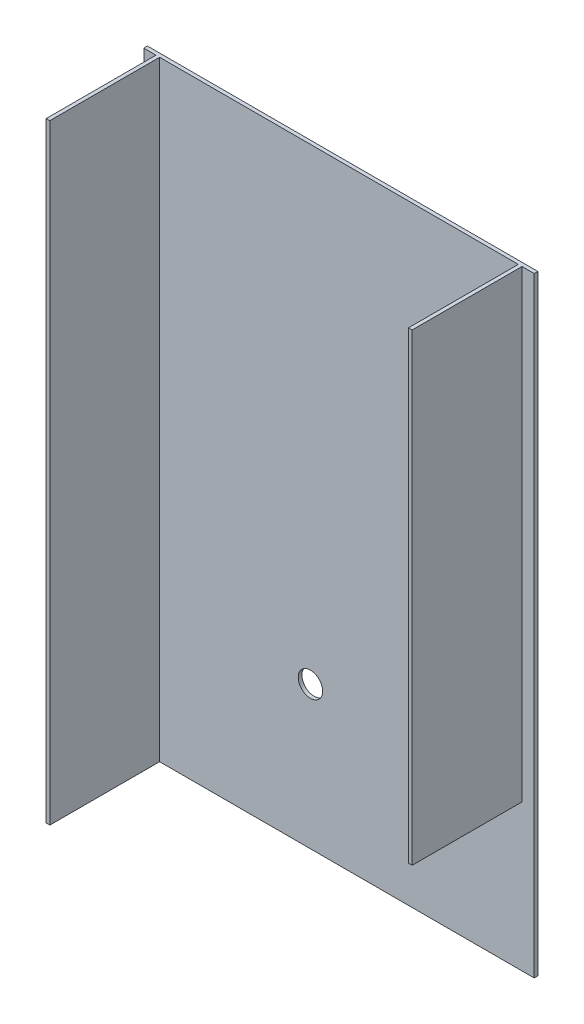
ISO-10303-21;
HEADER;
FILE_DESCRIPTION(('STEP AP214'),'2;1');
FILE_NAME('part.step','',(''),(''),'','','');
FILE_SCHEMA(('AUTOMOTIVE_DESIGN { 1 0 10303 214 1 1 1 1 }'));
ENDSEC;
DATA;
#1=APPLICATION_CONTEXT('core data for automotive mechanical design processes');
#2=APPLICATION_PROTOCOL_DEFINITION('international standard','automotive_design',2000,#1);
#3=PRODUCT_CONTEXT('',#1,'mechanical');
#4=PRODUCT('Part','Part','',(#3));
#5=PRODUCT_RELATED_PRODUCT_CATEGORY('part','',(#4));
#6=PRODUCT_DEFINITION_FORMATION('','',#4);
#7=PRODUCT_DEFINITION_CONTEXT('part definition',#1,'design');
#8=PRODUCT_DEFINITION('design','',#6,#7);
#9=PRODUCT_DEFINITION_SHAPE('','',#8);
#10=(LENGTH_UNIT() NAMED_UNIT(*) SI_UNIT(.MILLI.,.METRE.));
#11=(NAMED_UNIT(*) PLANE_ANGLE_UNIT() SI_UNIT($,.RADIAN.));
#12=(NAMED_UNIT(*) SI_UNIT($,.STERADIAN.) SOLID_ANGLE_UNIT());
#13=UNCERTAINTY_MEASURE_WITH_UNIT(LENGTH_MEASURE(1.E-05),#10,'distance_accuracy_value','');
#14=(GEOMETRIC_REPRESENTATION_CONTEXT(3) GLOBAL_UNCERTAINTY_ASSIGNED_CONTEXT((#13)) GLOBAL_UNIT_ASSIGNED_CONTEXT((#10,
#11,#12)) REPRESENTATION_CONTEXT('',''));
#15=CARTESIAN_POINT('',(0.,0.,0.));
#16=DIRECTION('',(0.,0.,1.));
#17=DIRECTION('',(1.,0.,0.));
#18=AXIS2_PLACEMENT_3D('',#15,#16,#17);
#19=CARTESIAN_POINT('',(0.,0.,1.5));
#20=DIRECTION('',(0.,0.,1.));
#21=DIRECTION('',(1.,0.,0.));
#22=AXIS2_PLACEMENT_3D('',#19,#20,#21);
#23=PLANE('',#22);
#24=CARTESIAN_POINT('',(-11.69,-66.6,1.5));
#25=DIRECTION('',(0.,0.,1.));
#26=DIRECTION('',(1.,0.,0.));
#27=AXIS2_PLACEMENT_3D('',#24,#25,#26);
#28=CIRCLE('',#27,5.);
#29=CARTESIAN_POINT('',(-6.69,-66.6,1.5));
#30=VERTEX_POINT('',#29);
#31=EDGE_CURVE('E190',#30,#30,#28,.T.);
#32=ORIENTED_EDGE('',*,*,#31,.F.);
#33=EDGE_LOOP('',(#32));
#34=FACE_BOUND('',#33,.T.);
#35=DIRECTION('',(1.,0.,0.));
#36=VECTOR('',#35,1.);
#37=CARTESIAN_POINT('',(73.5000000000001,-65.,1.5));
#38=LINE('',#37,#36);
#39=CARTESIAN_POINT('',(73.5000000000001,-65.,1.5));
#40=VERTEX_POINT('',#39);
#41=CARTESIAN_POINT('',(75.0000000000001,-65.,1.5));
#42=VERTEX_POINT('',#41);
#43=EDGE_CURVE('E54',#40,#42,#38,.T.);
#44=ORIENTED_EDGE('',*,*,#43,.F.);
#45=DIRECTION('',(0.,-1.,0.));
#46=VECTOR('',#45,1.);
#47=CARTESIAN_POINT('',(73.5,125.,1.5));
#48=LINE('',#47,#46);
#49=CARTESIAN_POINT('',(73.5,125.,1.5));
#50=VERTEX_POINT('',#49);
#51=EDGE_CURVE('E139',#50,#40,#48,.T.);
#52=ORIENTED_EDGE('',*,*,#51,.F.);
#53=DIRECTION('',(-1.,0.,0.));
#54=VECTOR('',#53,1.);
#55=CARTESIAN_POINT('',(-80.,125.,1.5));
#56=LINE('',#55,#54);
#57=CARTESIAN_POINT('',(-73.5,125.,1.5));
#58=VERTEX_POINT('',#57);
#59=EDGE_CURVE('E127',#50,#58,#56,.T.);
#60=ORIENTED_EDGE('',*,*,#59,.T.);
#61=DIRECTION('',(0.,-1.,0.));
#62=VECTOR('',#61,1.);
#63=CARTESIAN_POINT('',(-73.5,0.,1.5));
#64=LINE('',#63,#62);
#65=CARTESIAN_POINT('',(-73.5,-125.,1.5));
#66=VERTEX_POINT('',#65);
#67=EDGE_CURVE('E169',#58,#66,#64,.T.);
#68=ORIENTED_EDGE('',*,*,#67,.T.);
#69=DIRECTION('',(1.,0.,0.));
#70=VECTOR('',#69,1.);
#71=CARTESIAN_POINT('',(-80.,-125.,1.5));
#72=LINE('',#71,#70);
#73=CARTESIAN_POINT('',(80.,-125.,1.5));
#74=VERTEX_POINT('',#73);
#75=EDGE_CURVE('E202',#66,#74,#72,.T.);
#76=ORIENTED_EDGE('',*,*,#75,.T.);
#77=DIRECTION('',(0.,1.,0.));
#78=VECTOR('',#77,1.);
#79=CARTESIAN_POINT('',(80.,125.,1.5));
#80=LINE('',#79,#78);
#81=CARTESIAN_POINT('',(80.,125.,1.5));
#82=VERTEX_POINT('',#81);
#83=EDGE_CURVE('E196',#74,#82,#80,.T.);
#84=ORIENTED_EDGE('',*,*,#83,.T.);
#85=CARTESIAN_POINT('',(75.0000000000001,125.,1.5));
#86=VERTEX_POINT('',#85);
#87=EDGE_CURVE('E136',#82,#86,#56,.T.);
#88=ORIENTED_EDGE('',*,*,#87,.T.);
#89=DIRECTION('',(0.,-1.,0.));
#90=VECTOR('',#89,1.);
#91=CARTESIAN_POINT('',(75.,125.,1.5));
#92=LINE('',#91,#90);
#93=EDGE_CURVE('E59',#86,#42,#92,.T.);
#94=ORIENTED_EDGE('',*,*,#93,.T.);
#95=EDGE_LOOP('',(#44,#52,#60,#68,#76,#84,#88,#94));
#96=FACE_BOUND('',#95,.T.);
#97=ADVANCED_FACE('F39',(#34,#96),#23,.T.);
#98=CARTESIAN_POINT('',(80.,125.,1.5));
#99=DIRECTION('',(-1.,0.,0.));
#100=DIRECTION('',(0.,-1.,0.));
#101=AXIS2_PLACEMENT_3D('',#98,#99,#100);
#102=PLANE('',#101);
#103=DIRECTION('',(0.,1.,0.));
#104=VECTOR('',#103,1.);
#105=CARTESIAN_POINT('',(80.,125.,0.));
#106=LINE('',#105,#104);
#107=CARTESIAN_POINT('',(80.,-125.,0.));
#108=VERTEX_POINT('',#107);
#109=CARTESIAN_POINT('',(80.,125.,0.));
#110=VERTEX_POINT('',#109);
#111=EDGE_CURVE('E193',#108,#110,#106,.T.);
#112=ORIENTED_EDGE('',*,*,#111,.T.);
#113=DIRECTION('',(0.,0.,-1.));
#114=VECTOR('',#113,1.);
#115=CARTESIAN_POINT('',(80.,125.,1.5));
#116=LINE('',#115,#114);
#117=EDGE_CURVE('E11',#82,#110,#116,.T.);
#118=ORIENTED_EDGE('',*,*,#117,.F.);
#119=ORIENTED_EDGE('',*,*,#83,.F.);
#120=DIRECTION('',(0.,0.,-1.));
#121=VECTOR('',#120,1.);
#122=CARTESIAN_POINT('',(80.,-125.,1.5));
#123=LINE('',#122,#121);
#124=EDGE_CURVE('E205',#74,#108,#123,.T.);
#125=ORIENTED_EDGE('',*,*,#124,.T.);
#126=EDGE_LOOP('',(#112,#118,#119,#125));
#127=FACE_BOUND('',#126,.T.);
#128=ADVANCED_FACE('F41',(#127),#102,.F.);
#129=CARTESIAN_POINT('',(-80.,125.,1.5));
#130=DIRECTION('',(0.,-1.,0.));
#131=DIRECTION('',(0.,0.,-1.));
#132=AXIS2_PLACEMENT_3D('',#129,#130,#131);
#133=PLANE('',#132);
#134=DIRECTION('',(-1.,0.,0.));
#135=VECTOR('',#134,1.);
#136=CARTESIAN_POINT('',(-80.,125.,0.));
#137=LINE('',#136,#135);
#138=CARTESIAN_POINT('',(-80.,125.,0.));
#139=VERTEX_POINT('',#138);
#140=EDGE_CURVE('E208',#110,#139,#137,.T.);
#141=ORIENTED_EDGE('',*,*,#140,.T.);
#142=DIRECTION('',(0.,0.,-1.));
#143=VECTOR('',#142,1.);
#144=CARTESIAN_POINT('',(-80.,125.,1.5));
#145=LINE('',#144,#143);
#146=CARTESIAN_POINT('',(-80.,125.,1.5));
#147=VERTEX_POINT('',#146);
#148=EDGE_CURVE('E47',#147,#139,#145,.T.);
#149=ORIENTED_EDGE('',*,*,#148,.F.);
#150=CARTESIAN_POINT('',(-75.,125.,1.5));
#151=VERTEX_POINT('',#150);
#152=EDGE_CURVE('E137',#151,#147,#56,.T.);
#153=ORIENTED_EDGE('',*,*,#152,.F.);
#154=DIRECTION('',(0.,0.,-1.));
#155=VECTOR('',#154,1.);
#156=CARTESIAN_POINT('',(-75.,125.,46.5));
#157=LINE('',#156,#155);
#158=CARTESIAN_POINT('',(-75.,125.,46.5));
#159=VERTEX_POINT('',#158);
#160=EDGE_CURVE('E186',#159,#151,#157,.T.);
#161=ORIENTED_EDGE('',*,*,#160,.F.);
#162=DIRECTION('',(-1.,0.,0.));
#163=VECTOR('',#162,1.);
#164=CARTESIAN_POINT('',(0.,125.,46.5));
#165=LINE('',#164,#163);
#166=CARTESIAN_POINT('',(-73.5,125.,46.5));
#167=VERTEX_POINT('',#166);
#168=EDGE_CURVE('E165',#167,#159,#165,.T.);
#169=ORIENTED_EDGE('',*,*,#168,.F.);
#170=DIRECTION('',(0.,0.,-1.));
#171=VECTOR('',#170,1.);
#172=CARTESIAN_POINT('',(-73.5,125.,46.5));
#173=LINE('',#172,#171);
#174=EDGE_CURVE('E134',#167,#58,#173,.T.);
#175=ORIENTED_EDGE('',*,*,#174,.T.);
#176=ORIENTED_EDGE('',*,*,#59,.F.);
#177=DIRECTION('',(0.,0.,-1.));
#178=VECTOR('',#177,1.);
#179=CARTESIAN_POINT('',(73.5,125.,46.5));
#180=LINE('',#179,#178);
#181=CARTESIAN_POINT('',(73.5,125.,46.5));
#182=VERTEX_POINT('',#181);
#183=EDGE_CURVE('E131',#182,#50,#180,.T.);
#184=ORIENTED_EDGE('',*,*,#183,.F.);
#185=DIRECTION('',(1.,0.,0.));
#186=VECTOR('',#185,1.);
#187=CARTESIAN_POINT('',(73.5,125.,46.5));
#188=LINE('',#187,#186);
#189=CARTESIAN_POINT('',(75.,125.,46.5));
#190=VERTEX_POINT('',#189);
#191=EDGE_CURVE('E143',#182,#190,#188,.T.);
#192=ORIENTED_EDGE('',*,*,#191,.T.);
#193=DIRECTION('',(0.,0.,-1.));
#194=VECTOR('',#193,1.);
#195=CARTESIAN_POINT('',(75.,125.,46.5));
#196=LINE('',#195,#194);
#197=EDGE_CURVE('E159',#190,#86,#196,.T.);
#198=ORIENTED_EDGE('',*,*,#197,.T.);
#199=ORIENTED_EDGE('',*,*,#87,.F.);
#200=ORIENTED_EDGE('',*,*,#117,.T.);
#201=EDGE_LOOP('',(#141,#149,#153,#161,#169,#175,#176,#184,#192,#198,#199,#200));
#202=FACE_BOUND('',#201,.T.);
#203=ADVANCED_FACE('F128',(#202),#133,.F.);
#204=CARTESIAN_POINT('',(-80.,125.,1.5));
#205=DIRECTION('',(1.,0.,0.));
#206=DIRECTION('',(0.,1.,0.));
#207=AXIS2_PLACEMENT_3D('',#204,#205,#206);
#208=PLANE('',#207);
#209=DIRECTION('',(0.,-1.,0.));
#210=VECTOR('',#209,1.);
#211=CARTESIAN_POINT('',(-80.,125.,0.));
#212=LINE('',#211,#210);
#213=CARTESIAN_POINT('',(-80.,-125.,0.));
#214=VERTEX_POINT('',#213);
#215=EDGE_CURVE('E210',#139,#214,#212,.T.);
#216=ORIENTED_EDGE('',*,*,#215,.T.);
#217=DIRECTION('',(0.,0.,-1.));
#218=VECTOR('',#217,1.);
#219=CARTESIAN_POINT('',(-80.,-125.,1.5));
#220=LINE('',#219,#218);
#221=CARTESIAN_POINT('',(-80.,-125.,1.5));
#222=VERTEX_POINT('',#221);
#223=EDGE_CURVE('E215',#222,#214,#220,.T.);
#224=ORIENTED_EDGE('',*,*,#223,.F.);
#225=DIRECTION('',(0.,-1.,0.));
#226=VECTOR('',#225,1.);
#227=CARTESIAN_POINT('',(-80.,125.,1.5));
#228=LINE('',#227,#226);
#229=EDGE_CURVE('E200',#147,#222,#228,.T.);
#230=ORIENTED_EDGE('',*,*,#229,.F.);
#231=ORIENTED_EDGE('',*,*,#148,.T.);
#232=EDGE_LOOP('',(#216,#224,#230,#231));
#233=FACE_BOUND('',#232,.T.);
#234=ADVANCED_FACE('F222',(#233),#208,.F.);
#235=CARTESIAN_POINT('',(-80.,-125.,1.5));
#236=DIRECTION('',(0.,1.,0.));
#237=DIRECTION('',(0.,0.,1.));
#238=AXIS2_PLACEMENT_3D('',#235,#236,#237);
#239=PLANE('',#238);
#240=DIRECTION('',(1.,0.,0.));
#241=VECTOR('',#240,1.);
#242=CARTESIAN_POINT('',(-80.,-125.,0.));
#243=LINE('',#242,#241);
#244=EDGE_CURVE('E198',#214,#108,#243,.T.);
#245=ORIENTED_EDGE('',*,*,#244,.T.);
#246=ORIENTED_EDGE('',*,*,#124,.F.);
#247=ORIENTED_EDGE('',*,*,#75,.F.);
#248=DIRECTION('',(0.,0.,-1.));
#249=VECTOR('',#248,1.);
#250=CARTESIAN_POINT('',(-73.5,-125.,46.5));
#251=LINE('',#250,#249);
#252=CARTESIAN_POINT('',(-73.5,-125.,46.5));
#253=VERTEX_POINT('',#252);
#254=EDGE_CURVE('E180',#253,#66,#251,.T.);
#255=ORIENTED_EDGE('',*,*,#254,.F.);
#256=DIRECTION('',(1.,0.,0.));
#257=VECTOR('',#256,1.);
#258=CARTESIAN_POINT('',(0.,-125.,46.5));
#259=LINE('',#258,#257);
#260=CARTESIAN_POINT('',(-75.,-125.,46.5));
#261=VERTEX_POINT('',#260);
#262=EDGE_CURVE('E171',#261,#253,#259,.T.);
#263=ORIENTED_EDGE('',*,*,#262,.F.);
#264=DIRECTION('',(0.,0.,-1.));
#265=VECTOR('',#264,1.);
#266=CARTESIAN_POINT('',(-75.,-125.,46.5));
#267=LINE('',#266,#265);
#268=CARTESIAN_POINT('',(-75.,-125.,1.5));
#269=VERTEX_POINT('',#268);
#270=EDGE_CURVE('E183',#261,#269,#267,.T.);
#271=ORIENTED_EDGE('',*,*,#270,.T.);
#272=EDGE_CURVE('E203',#222,#269,#72,.T.);
#273=ORIENTED_EDGE('',*,*,#272,.F.);
#274=ORIENTED_EDGE('',*,*,#223,.T.);
#275=EDGE_LOOP('',(#245,#246,#247,#255,#263,#271,#273,#274));
#276=FACE_BOUND('',#275,.T.);
#277=ADVANCED_FACE('F231',(#276),#239,.F.);
#278=DIRECTION('',(0.,-1.,0.));
#279=VECTOR('',#278,1.);
#280=CARTESIAN_POINT('',(-75.,0.,1.5));
#281=LINE('',#280,#279);
#282=EDGE_CURVE('E156',#151,#269,#281,.T.);
#283=ORIENTED_EDGE('',*,*,#282,.F.);
#284=ORIENTED_EDGE('',*,*,#152,.T.);
#285=ORIENTED_EDGE('',*,*,#229,.T.);
#286=ORIENTED_EDGE('',*,*,#272,.T.);
#287=EDGE_LOOP('',(#283,#284,#285,#286));
#288=FACE_BOUND('',#287,.T.);
#289=ADVANCED_FACE('F250',(#288),#23,.T.);
#290=CARTESIAN_POINT('',(0.,0.,0.));
#291=DIRECTION('',(0.,0.,1.));
#292=DIRECTION('',(1.,0.,0.));
#293=AXIS2_PLACEMENT_3D('',#290,#291,#292);
#294=PLANE('',#293);
#295=CARTESIAN_POINT('',(-11.69,-66.6,0.));
#296=DIRECTION('',(0.,0.,1.));
#297=DIRECTION('',(1.,0.,0.));
#298=AXIS2_PLACEMENT_3D('',#295,#296,#297);
#299=CIRCLE('',#298,5.);
#300=CARTESIAN_POINT('',(-6.69,-66.6,0.));
#301=VERTEX_POINT('',#300);
#302=EDGE_CURVE('E189',#301,#301,#299,.T.);
#303=ORIENTED_EDGE('',*,*,#302,.T.);
#304=EDGE_LOOP('',(#303));
#305=FACE_BOUND('',#304,.T.);
#306=ORIENTED_EDGE('',*,*,#111,.F.);
#307=ORIENTED_EDGE('',*,*,#244,.F.);
#308=ORIENTED_EDGE('',*,*,#215,.F.);
#309=ORIENTED_EDGE('',*,*,#140,.F.);
#310=EDGE_LOOP('',(#306,#307,#308,#309));
#311=FACE_BOUND('',#310,.T.);
#312=ADVANCED_FACE('F228',(#305,#311),#294,.F.);
#313=CARTESIAN_POINT('',(-11.69,-66.6,1.5));
#314=DIRECTION('',(0.,0.,-1.));
#315=DIRECTION('',(-1.,0.,0.));
#316=AXIS2_PLACEMENT_3D('',#313,#314,#315);
#317=CYLINDRICAL_SURFACE('',#316,5.);
#318=ORIENTED_EDGE('',*,*,#31,.T.);
#319=EDGE_LOOP('',(#318));
#320=FACE_BOUND('',#319,.T.);
#321=ORIENTED_EDGE('',*,*,#302,.F.);
#322=EDGE_LOOP('',(#321));
#323=FACE_BOUND('',#322,.T.);
#324=ADVANCED_FACE('F257',(#320,#323),#317,.F.);
#325=CARTESIAN_POINT('',(-75.,0.,46.5));
#326=DIRECTION('',(1.,0.,0.));
#327=DIRECTION('',(0.,1.,0.));
#328=AXIS2_PLACEMENT_3D('',#325,#326,#327);
#329=PLANE('',#328);
#330=ORIENTED_EDGE('',*,*,#282,.T.);
#331=ORIENTED_EDGE('',*,*,#270,.F.);
#332=DIRECTION('',(0.,-1.,0.));
#333=VECTOR('',#332,1.);
#334=CARTESIAN_POINT('',(-75.,0.,46.5));
#335=LINE('',#334,#333);
#336=EDGE_CURVE('E168',#159,#261,#335,.T.);
#337=ORIENTED_EDGE('',*,*,#336,.F.);
#338=ORIENTED_EDGE('',*,*,#160,.T.);
#339=EDGE_LOOP('',(#330,#331,#337,#338));
#340=FACE_BOUND('',#339,.T.);
#341=ADVANCED_FACE('F248',(#340),#329,.F.);
#342=CARTESIAN_POINT('',(-73.5,0.,46.5));
#343=DIRECTION('',(1.,0.,0.));
#344=DIRECTION('',(0.,1.,0.));
#345=AXIS2_PLACEMENT_3D('',#342,#343,#344);
#346=PLANE('',#345);
#347=ORIENTED_EDGE('',*,*,#67,.F.);
#348=ORIENTED_EDGE('',*,*,#174,.F.);
#349=DIRECTION('',(0.,-1.,0.));
#350=VECTOR('',#349,1.);
#351=CARTESIAN_POINT('',(-73.5,0.,46.5));
#352=LINE('',#351,#350);
#353=EDGE_CURVE('E173',#167,#253,#352,.T.);
#354=ORIENTED_EDGE('',*,*,#353,.T.);
#355=ORIENTED_EDGE('',*,*,#254,.T.);
#356=EDGE_LOOP('',(#347,#348,#354,#355));
#357=FACE_BOUND('',#356,.T.);
#358=ADVANCED_FACE('F241',(#357),#346,.T.);
#359=CARTESIAN_POINT('',(0.,0.,46.5));
#360=DIRECTION('',(0.,0.,1.));
#361=DIRECTION('',(1.,0.,0.));
#362=AXIS2_PLACEMENT_3D('',#359,#360,#361);
#363=PLANE('',#362);
#364=ORIENTED_EDGE('',*,*,#168,.T.);
#365=ORIENTED_EDGE('',*,*,#336,.T.);
#366=ORIENTED_EDGE('',*,*,#262,.T.);
#367=ORIENTED_EDGE('',*,*,#353,.F.);
#368=EDGE_LOOP('',(#364,#365,#366,#367));
#369=FACE_BOUND('',#368,.T.);
#370=ADVANCED_FACE('F244',(#369),#363,.T.);
#371=CARTESIAN_POINT('',(73.5,125.,46.5));
#372=DIRECTION('',(1.,0.,0.));
#373=DIRECTION('',(0.,1.,0.));
#374=AXIS2_PLACEMENT_3D('',#371,#372,#373);
#375=PLANE('',#374);
#376=ORIENTED_EDGE('',*,*,#51,.T.);
#377=DIRECTION('',(0.,0.,-1.));
#378=VECTOR('',#377,1.);
#379=CARTESIAN_POINT('',(73.5000000000001,-65.,46.5));
#380=LINE('',#379,#378);
#381=CARTESIAN_POINT('',(73.5000000000001,-65.,46.5));
#382=VERTEX_POINT('',#381);
#383=EDGE_CURVE('E148',#382,#40,#380,.T.);
#384=ORIENTED_EDGE('',*,*,#383,.F.);
#385=DIRECTION('',(0.,-1.,0.));
#386=VECTOR('',#385,1.);
#387=CARTESIAN_POINT('',(73.5,125.,46.5));
#388=LINE('',#387,#386);
#389=EDGE_CURVE('E146',#182,#382,#388,.T.);
#390=ORIENTED_EDGE('',*,*,#389,.F.);
#391=ORIENTED_EDGE('',*,*,#183,.T.);
#392=EDGE_LOOP('',(#376,#384,#390,#391));
#393=FACE_BOUND('',#392,.T.);
#394=ADVANCED_FACE('F145',(#393),#375,.F.);
#395=CARTESIAN_POINT('',(73.5000000000001,-65.,46.5));
#396=DIRECTION('',(0.,1.,0.));
#397=DIRECTION('',(0.,0.,1.));
#398=AXIS2_PLACEMENT_3D('',#395,#396,#397);
#399=PLANE('',#398);
#400=ORIENTED_EDGE('',*,*,#43,.T.);
#401=DIRECTION('',(0.,0.,-1.));
#402=VECTOR('',#401,1.);
#403=CARTESIAN_POINT('',(75.0000000000001,-65.,46.5));
#404=LINE('',#403,#402);
#405=CARTESIAN_POINT('',(75.0000000000001,-65.,46.5));
#406=VERTEX_POINT('',#405);
#407=EDGE_CURVE('E150',#406,#42,#404,.T.);
#408=ORIENTED_EDGE('',*,*,#407,.F.);
#409=DIRECTION('',(1.,0.,0.));
#410=VECTOR('',#409,1.);
#411=CARTESIAN_POINT('',(73.5000000000001,-65.,46.5));
#412=LINE('',#411,#410);
#413=EDGE_CURVE('E158',#382,#406,#412,.T.);
#414=ORIENTED_EDGE('',*,*,#413,.F.);
#415=ORIENTED_EDGE('',*,*,#383,.T.);
#416=EDGE_LOOP('',(#400,#408,#414,#415));
#417=FACE_BOUND('',#416,.T.);
#418=ADVANCED_FACE('F288',(#417),#399,.F.);
#419=CARTESIAN_POINT('',(75.,125.,46.5));
#420=DIRECTION('',(1.,0.,0.));
#421=DIRECTION('',(0.,1.,0.));
#422=AXIS2_PLACEMENT_3D('',#419,#420,#421);
#423=PLANE('',#422);
#424=ORIENTED_EDGE('',*,*,#93,.F.);
#425=ORIENTED_EDGE('',*,*,#197,.F.);
#426=DIRECTION('',(0.,-1.,0.));
#427=VECTOR('',#426,1.);
#428=CARTESIAN_POINT('',(75.,125.,46.5));
#429=LINE('',#428,#427);
#430=EDGE_CURVE('E161',#190,#406,#429,.T.);
#431=ORIENTED_EDGE('',*,*,#430,.T.);
#432=ORIENTED_EDGE('',*,*,#407,.T.);
#433=EDGE_LOOP('',(#424,#425,#431,#432));
#434=FACE_BOUND('',#433,.T.);
#435=ADVANCED_FACE('F284',(#434),#423,.T.);
#436=CARTESIAN_POINT('',(0.,0.,46.5));
#437=DIRECTION('',(0.,0.,-1.));
#438=DIRECTION('',(-1.,0.,0.));
#439=AXIS2_PLACEMENT_3D('',#436,#437,#438);
#440=PLANE('',#439);
#441=ORIENTED_EDGE('',*,*,#191,.F.);
#442=ORIENTED_EDGE('',*,*,#389,.T.);
#443=ORIENTED_EDGE('',*,*,#413,.T.);
#444=ORIENTED_EDGE('',*,*,#430,.F.);
#445=EDGE_LOOP('',(#441,#442,#443,#444));
#446=FACE_BOUND('',#445,.T.);
#447=ADVANCED_FACE('F281',(#446),#440,.F.);
#448=CLOSED_SHELL('',(#97,#128,#203,#234,#277,#289,#312,#324,#341,#358,#370,#394,#418,#435,#447));
#449=MANIFOLD_SOLID_BREP('B2',#448);
#450=ADVANCED_BREP_SHAPE_REPRESENTATION('',(#18,#449),#14);
#451=SHAPE_DEFINITION_REPRESENTATION(#9,#450);
ENDSEC;
END-ISO-10303-21;
